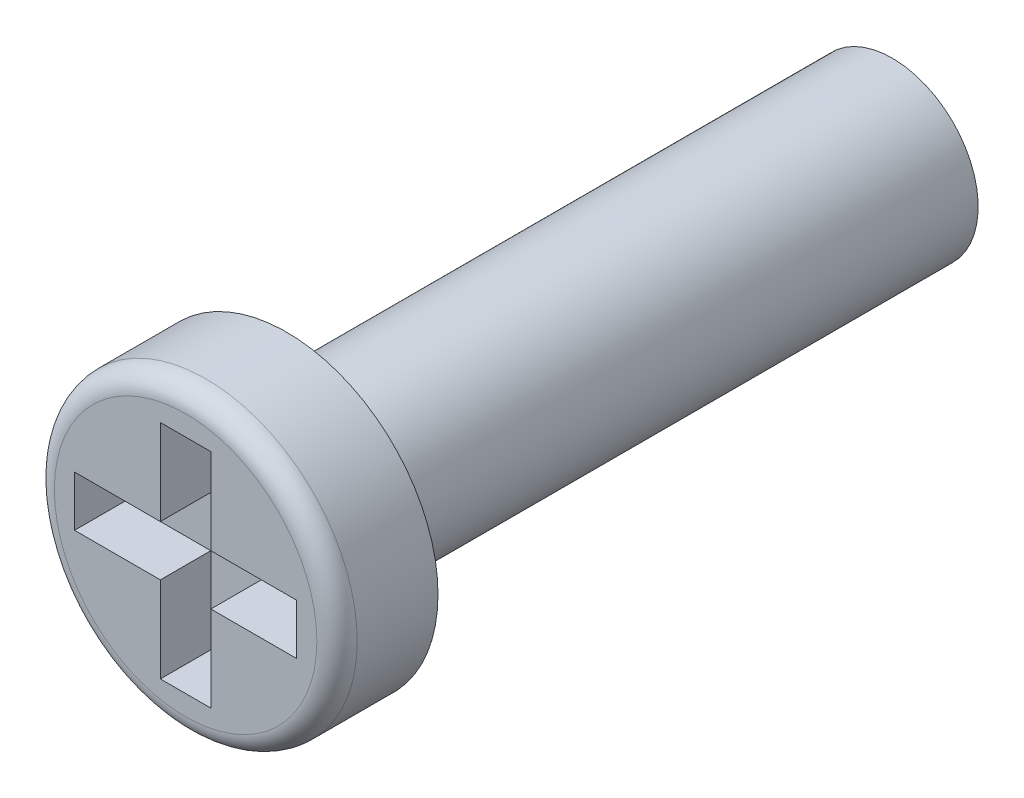
ISO-10303-21;
HEADER;
FILE_DESCRIPTION(('STEP AP214'),'2;1');
FILE_NAME('part.step','',(''),(''),'','','');
FILE_SCHEMA(('AUTOMOTIVE_DESIGN { 1 0 10303 214 1 1 1 1 }'));
ENDSEC;
DATA;
#1=APPLICATION_CONTEXT('core data for automotive mechanical design processes');
#2=APPLICATION_PROTOCOL_DEFINITION('international standard','automotive_design',2000,#1);
#3=PRODUCT_CONTEXT('',#1,'mechanical');
#4=PRODUCT('Part','Part','',(#3));
#5=PRODUCT_RELATED_PRODUCT_CATEGORY('part','',(#4));
#6=PRODUCT_DEFINITION_FORMATION('','',#4);
#7=PRODUCT_DEFINITION_CONTEXT('part definition',#1,'design');
#8=PRODUCT_DEFINITION('design','',#6,#7);
#9=PRODUCT_DEFINITION_SHAPE('','',#8);
#10=(LENGTH_UNIT() NAMED_UNIT(*) SI_UNIT(.MILLI.,.METRE.));
#11=(NAMED_UNIT(*) PLANE_ANGLE_UNIT() SI_UNIT($,.RADIAN.));
#12=(NAMED_UNIT(*) SI_UNIT($,.STERADIAN.) SOLID_ANGLE_UNIT());
#13=UNCERTAINTY_MEASURE_WITH_UNIT(LENGTH_MEASURE(1.E-05),#10,'distance_accuracy_value','');
#14=(GEOMETRIC_REPRESENTATION_CONTEXT(3) GLOBAL_UNCERTAINTY_ASSIGNED_CONTEXT((#13)) GLOBAL_UNIT_ASSIGNED_CONTEXT((#10,
#11,#12)) REPRESENTATION_CONTEXT('',''));
#15=CARTESIAN_POINT('',(0.,0.,0.));
#16=DIRECTION('',(0.,0.,1.));
#17=DIRECTION('',(1.,0.,0.));
#18=AXIS2_PLACEMENT_3D('',#15,#16,#17);
#19=CARTESIAN_POINT('',(0.,0.,1.));
#20=DIRECTION('',(0.,0.,-1.));
#21=DIRECTION('',(-1.,0.,0.));
#22=AXIS2_PLACEMENT_3D('',#19,#20,#21);
#23=CYLINDRICAL_SURFACE('',#22,1.5);
#24=CARTESIAN_POINT('',(0.,0.,0.8));
#25=DIRECTION('',(0.,0.,1.));
#26=DIRECTION('',(1.,0.,0.));
#27=AXIS2_PLACEMENT_3D('',#24,#25,#26);
#28=CIRCLE('',#27,1.5);
#29=CARTESIAN_POINT('',(1.5,0.,0.8));
#30=VERTEX_POINT('',#29);
#31=EDGE_CURVE('E11',#30,#30,#28,.F.);
#32=ORIENTED_EDGE('',*,*,#31,.T.);
#33=EDGE_LOOP('',(#32));
#34=FACE_BOUND('',#33,.T.);
#35=CARTESIAN_POINT('',(0.,0.,0.));
#36=DIRECTION('',(0.,0.,1.));
#37=DIRECTION('',(1.,0.,0.));
#38=AXIS2_PLACEMENT_3D('',#35,#36,#37);
#39=CIRCLE('',#38,1.5);
#40=CARTESIAN_POINT('',(1.5,0.,0.));
#41=VERTEX_POINT('',#40);
#42=EDGE_CURVE('E210',#41,#41,#39,.T.);
#43=ORIENTED_EDGE('',*,*,#42,.T.);
#44=EDGE_LOOP('',(#43));
#45=FACE_BOUND('',#44,.T.);
#46=ADVANCED_FACE('F34',(#34,#45),#23,.T.);
#47=CARTESIAN_POINT('',(0.,0.,1.));
#48=DIRECTION('',(0.,0.,1.));
#49=DIRECTION('',(1.,0.,0.));
#50=AXIS2_PLACEMENT_3D('',#47,#48,#49);
#51=PLANE('',#50);
#52=CARTESIAN_POINT('',(0.,0.,1.));
#53=DIRECTION('',(0.,0.,1.));
#54=DIRECTION('',(1.,0.,0.));
#55=AXIS2_PLACEMENT_3D('',#52,#53,#54);
#56=CIRCLE('',#55,1.3);
#57=CARTESIAN_POINT('',(1.3,0.,1.));
#58=VERTEX_POINT('',#57);
#59=EDGE_CURVE('E42',#58,#58,#56,.T.);
#60=ORIENTED_EDGE('',*,*,#59,.T.);
#61=EDGE_LOOP('',(#60));
#62=FACE_BOUND('',#61,.T.);
#63=DIRECTION('',(0.,1.,0.));
#64=VECTOR('',#63,1.);
#65=CARTESIAN_POINT('',(0.25,-1.1,1.));
#66=LINE('',#65,#64);
#67=CARTESIAN_POINT('',(0.25,-1.1,1.));
#68=VERTEX_POINT('',#67);
#69=CARTESIAN_POINT('',(0.25,-0.25,1.));
#70=VERTEX_POINT('',#69);
#71=EDGE_CURVE('E49',#68,#70,#66,.T.);
#72=ORIENTED_EDGE('',*,*,#71,.F.);
#73=DIRECTION('',(1.,0.,0.));
#74=VECTOR('',#73,1.);
#75=CARTESIAN_POINT('',(-0.25,-1.1,1.));
#76=LINE('',#75,#74);
#77=CARTESIAN_POINT('',(-0.25,-1.1,1.));
#78=VERTEX_POINT('',#77);
#79=EDGE_CURVE('E186',#78,#68,#76,.T.);
#80=ORIENTED_EDGE('',*,*,#79,.F.);
#81=DIRECTION('',(0.,-1.,0.));
#82=VECTOR('',#81,1.);
#83=CARTESIAN_POINT('',(-0.25,-1.1,1.));
#84=LINE('',#83,#82);
#85=CARTESIAN_POINT('',(-0.25,-0.25,1.));
#86=VERTEX_POINT('',#85);
#87=EDGE_CURVE('E184',#86,#78,#84,.T.);
#88=ORIENTED_EDGE('',*,*,#87,.F.);
#89=DIRECTION('',(1.,0.,0.));
#90=VECTOR('',#89,1.);
#91=CARTESIAN_POINT('',(-1.1,-0.25,1.));
#92=LINE('',#91,#90);
#93=CARTESIAN_POINT('',(-1.1,-0.25,1.));
#94=VERTEX_POINT('',#93);
#95=EDGE_CURVE('E133',#94,#86,#92,.T.);
#96=ORIENTED_EDGE('',*,*,#95,.F.);
#97=DIRECTION('',(0.,-1.,0.));
#98=VECTOR('',#97,1.);
#99=CARTESIAN_POINT('',(-1.1,0.25,1.));
#100=LINE('',#99,#98);
#101=CARTESIAN_POINT('',(-1.1,0.25,1.));
#102=VERTEX_POINT('',#101);
#103=EDGE_CURVE('E180',#102,#94,#100,.T.);
#104=ORIENTED_EDGE('',*,*,#103,.F.);
#105=DIRECTION('',(-1.,0.,0.));
#106=VECTOR('',#105,1.);
#107=CARTESIAN_POINT('',(-1.1,0.25,1.));
#108=LINE('',#107,#106);
#109=CARTESIAN_POINT('',(-0.25,0.25,1.));
#110=VERTEX_POINT('',#109);
#111=EDGE_CURVE('E177',#110,#102,#108,.T.);
#112=ORIENTED_EDGE('',*,*,#111,.F.);
#113=DIRECTION('',(0.,-1.,0.));
#114=VECTOR('',#113,1.);
#115=CARTESIAN_POINT('',(-0.25,1.1,1.));
#116=LINE('',#115,#114);
#117=CARTESIAN_POINT('',(-0.25,1.1,1.));
#118=VERTEX_POINT('',#117);
#119=EDGE_CURVE('E174',#118,#110,#116,.T.);
#120=ORIENTED_EDGE('',*,*,#119,.F.);
#121=DIRECTION('',(-1.,0.,0.));
#122=VECTOR('',#121,1.);
#123=CARTESIAN_POINT('',(-0.25,1.1,1.));
#124=LINE('',#123,#122);
#125=CARTESIAN_POINT('',(0.25,1.1,1.));
#126=VERTEX_POINT('',#125);
#127=EDGE_CURVE('E171',#126,#118,#124,.T.);
#128=ORIENTED_EDGE('',*,*,#127,.F.);
#129=DIRECTION('',(0.,1.,0.));
#130=VECTOR('',#129,1.);
#131=CARTESIAN_POINT('',(0.25,1.1,1.));
#132=LINE('',#131,#130);
#133=CARTESIAN_POINT('',(0.25,0.25,1.));
#134=VERTEX_POINT('',#133);
#135=EDGE_CURVE('E168',#134,#126,#132,.T.);
#136=ORIENTED_EDGE('',*,*,#135,.F.);
#137=DIRECTION('',(-1.,0.,0.));
#138=VECTOR('',#137,1.);
#139=CARTESIAN_POINT('',(0.25,0.25,1.));
#140=LINE('',#139,#138);
#141=CARTESIAN_POINT('',(1.1,0.25,1.));
#142=VERTEX_POINT('',#141);
#143=EDGE_CURVE('E165',#142,#134,#140,.T.);
#144=ORIENTED_EDGE('',*,*,#143,.F.);
#145=DIRECTION('',(0.,1.,0.));
#146=VECTOR('',#145,1.);
#147=CARTESIAN_POINT('',(1.1,0.25,1.));
#148=LINE('',#147,#146);
#149=CARTESIAN_POINT('',(1.1,-0.25,1.));
#150=VERTEX_POINT('',#149);
#151=EDGE_CURVE('E162',#150,#142,#148,.T.);
#152=ORIENTED_EDGE('',*,*,#151,.F.);
#153=DIRECTION('',(1.,0.,0.));
#154=VECTOR('',#153,1.);
#155=CARTESIAN_POINT('',(0.25,-0.25,1.));
#156=LINE('',#155,#154);
#157=EDGE_CURVE('E159',#70,#150,#156,.T.);
#158=ORIENTED_EDGE('',*,*,#157,.F.);
#159=EDGE_LOOP('',(#72,#80,#88,#96,#104,#112,#120,#128,#136,#144,#152,#158));
#160=FACE_BOUND('',#159,.T.);
#161=ADVANCED_FACE('F218',(#62,#160),#51,.T.);
#162=CARTESIAN_POINT('',(0.,0.,0.));
#163=DIRECTION('',(0.,0.,1.));
#164=DIRECTION('',(1.,0.,0.));
#165=AXIS2_PLACEMENT_3D('',#162,#163,#164);
#166=PLANE('',#165);
#167=CARTESIAN_POINT('',(0.,0.,0.));
#168=DIRECTION('',(0.,0.,-1.));
#169=DIRECTION('',(-1.,0.,0.));
#170=AXIS2_PLACEMENT_3D('',#167,#168,#169);
#171=CIRCLE('',#170,0.85);
#172=CARTESIAN_POINT('',(-0.85,0.,0.));
#173=VERTEX_POINT('',#172);
#174=EDGE_CURVE('E211',#173,#173,#171,.T.);
#175=ORIENTED_EDGE('',*,*,#174,.F.);
#176=EDGE_LOOP('',(#175));
#177=FACE_BOUND('',#176,.T.);
#178=ORIENTED_EDGE('',*,*,#42,.F.);
#179=EDGE_LOOP('',(#178));
#180=FACE_BOUND('',#179,.T.);
#181=ADVANCED_FACE('F234',(#177,#180),#166,.F.);
#182=CARTESIAN_POINT('',(0.,0.,-6.));
#183=DIRECTION('',(0.,0.,1.));
#184=DIRECTION('',(1.,0.,0.));
#185=AXIS2_PLACEMENT_3D('',#182,#183,#184);
#186=CYLINDRICAL_SURFACE('',#185,0.85);
#187=CARTESIAN_POINT('',(0.,0.,-6.));
#188=DIRECTION('',(0.,0.,-1.));
#189=DIRECTION('',(-1.,0.,0.));
#190=AXIS2_PLACEMENT_3D('',#187,#188,#189);
#191=CIRCLE('',#190,0.85);
#192=CARTESIAN_POINT('',(-0.85,0.,-6.));
#193=VERTEX_POINT('',#192);
#194=EDGE_CURVE('E190',#193,#193,#191,.T.);
#195=ORIENTED_EDGE('',*,*,#194,.F.);
#196=EDGE_LOOP('',(#195));
#197=FACE_BOUND('',#196,.T.);
#198=ORIENTED_EDGE('',*,*,#174,.T.);
#199=EDGE_LOOP('',(#198));
#200=FACE_BOUND('',#199,.T.);
#201=ADVANCED_FACE('F239',(#197,#200),#186,.T.);
#202=CARTESIAN_POINT('',(0.,0.,-6.));
#203=DIRECTION('',(0.,0.,-1.));
#204=DIRECTION('',(-1.,0.,0.));
#205=AXIS2_PLACEMENT_3D('',#202,#203,#204);
#206=PLANE('',#205);
#207=ORIENTED_EDGE('',*,*,#194,.T.);
#208=EDGE_LOOP('',(#207));
#209=FACE_BOUND('',#208,.T.);
#210=ADVANCED_FACE('F244',(#209),#206,.T.);
#211=CARTESIAN_POINT('',(0.25,-1.1,0.5));
#212=DIRECTION('',(1.,0.,0.));
#213=DIRECTION('',(0.,1.,0.));
#214=AXIS2_PLACEMENT_3D('',#211,#212,#213);
#215=PLANE('',#214);
#216=ORIENTED_EDGE('',*,*,#71,.T.);
#217=DIRECTION('',(0.,0.,1.));
#218=VECTOR('',#217,1.);
#219=CARTESIAN_POINT('',(0.25,-0.25,0.5));
#220=LINE('',#219,#218);
#221=CARTESIAN_POINT('',(0.25,-0.25,0.5));
#222=VERTEX_POINT('',#221);
#223=EDGE_CURVE('E97',#222,#70,#220,.T.);
#224=ORIENTED_EDGE('',*,*,#223,.F.);
#225=DIRECTION('',(0.,1.,0.));
#226=VECTOR('',#225,1.);
#227=CARTESIAN_POINT('',(0.25,-1.1,0.5));
#228=LINE('',#227,#226);
#229=CARTESIAN_POINT('',(0.25,-1.1,0.5));
#230=VERTEX_POINT('',#229);
#231=EDGE_CURVE('E188',#230,#222,#228,.T.);
#232=ORIENTED_EDGE('',*,*,#231,.F.);
#233=DIRECTION('',(0.,0.,1.));
#234=VECTOR('',#233,1.);
#235=CARTESIAN_POINT('',(0.25,-1.1,0.5));
#236=LINE('',#235,#234);
#237=EDGE_CURVE('E57',#230,#68,#236,.T.);
#238=ORIENTED_EDGE('',*,*,#237,.T.);
#239=EDGE_LOOP('',(#216,#224,#232,#238));
#240=FACE_BOUND('',#239,.T.);
#241=ADVANCED_FACE('F248',(#240),#215,.F.);
#242=CARTESIAN_POINT('',(-0.25,-1.1,0.5));
#243=DIRECTION('',(0.,-1.,0.));
#244=DIRECTION('',(0.,0.,-1.));
#245=AXIS2_PLACEMENT_3D('',#242,#243,#244);
#246=PLANE('',#245);
#247=ORIENTED_EDGE('',*,*,#79,.T.);
#248=ORIENTED_EDGE('',*,*,#237,.F.);
#249=DIRECTION('',(1.,0.,0.));
#250=VECTOR('',#249,1.);
#251=CARTESIAN_POINT('',(-0.25,-1.1,0.5));
#252=LINE('',#251,#250);
#253=CARTESIAN_POINT('',(-0.25,-1.1,0.5));
#254=VERTEX_POINT('',#253);
#255=EDGE_CURVE('E145',#254,#230,#252,.T.);
#256=ORIENTED_EDGE('',*,*,#255,.F.);
#257=DIRECTION('',(0.,0.,1.));
#258=VECTOR('',#257,1.);
#259=CARTESIAN_POINT('',(-0.25,-1.1,0.5));
#260=LINE('',#259,#258);
#261=EDGE_CURVE('E137',#254,#78,#260,.T.);
#262=ORIENTED_EDGE('',*,*,#261,.T.);
#263=EDGE_LOOP('',(#247,#248,#256,#262));
#264=FACE_BOUND('',#263,.T.);
#265=ADVANCED_FACE('F252',(#264),#246,.F.);
#266=CARTESIAN_POINT('',(-0.25,-1.1,0.5));
#267=DIRECTION('',(-1.,0.,0.));
#268=DIRECTION('',(0.,-1.,0.));
#269=AXIS2_PLACEMENT_3D('',#266,#267,#268);
#270=PLANE('',#269);
#271=ORIENTED_EDGE('',*,*,#87,.T.);
#272=ORIENTED_EDGE('',*,*,#261,.F.);
#273=DIRECTION('',(0.,-1.,0.));
#274=VECTOR('',#273,1.);
#275=CARTESIAN_POINT('',(-0.25,-1.1,0.5));
#276=LINE('',#275,#274);
#277=CARTESIAN_POINT('',(-0.25,-0.25,0.5));
#278=VERTEX_POINT('',#277);
#279=EDGE_CURVE('E141',#278,#254,#276,.T.);
#280=ORIENTED_EDGE('',*,*,#279,.F.);
#281=DIRECTION('',(0.,0.,1.));
#282=VECTOR('',#281,1.);
#283=CARTESIAN_POINT('',(-0.25,-0.25,0.5));
#284=LINE('',#283,#282);
#285=EDGE_CURVE('E126',#278,#86,#284,.T.);
#286=ORIENTED_EDGE('',*,*,#285,.T.);
#287=EDGE_LOOP('',(#271,#272,#280,#286));
#288=FACE_BOUND('',#287,.T.);
#289=ADVANCED_FACE('F142',(#288),#270,.F.);
#290=CARTESIAN_POINT('',(-1.1,-0.25,0.5));
#291=DIRECTION('',(0.,-1.,0.));
#292=DIRECTION('',(0.,0.,-1.));
#293=AXIS2_PLACEMENT_3D('',#290,#291,#292);
#294=PLANE('',#293);
#295=ORIENTED_EDGE('',*,*,#95,.T.);
#296=ORIENTED_EDGE('',*,*,#285,.F.);
#297=DIRECTION('',(1.,0.,0.));
#298=VECTOR('',#297,1.);
#299=CARTESIAN_POINT('',(-1.1,-0.25,0.5));
#300=LINE('',#299,#298);
#301=CARTESIAN_POINT('',(-1.1,-0.25,0.5));
#302=VERTEX_POINT('',#301);
#303=EDGE_CURVE('E130',#302,#278,#300,.T.);
#304=ORIENTED_EDGE('',*,*,#303,.F.);
#305=DIRECTION('',(0.,0.,1.));
#306=VECTOR('',#305,1.);
#307=CARTESIAN_POINT('',(-1.1,-0.25,0.5));
#308=LINE('',#307,#306);
#309=EDGE_CURVE('E138',#302,#94,#308,.T.);
#310=ORIENTED_EDGE('',*,*,#309,.T.);
#311=EDGE_LOOP('',(#295,#296,#304,#310));
#312=FACE_BOUND('',#311,.T.);
#313=ADVANCED_FACE('F128',(#312),#294,.F.);
#314=CARTESIAN_POINT('',(-1.1,0.25,0.5));
#315=DIRECTION('',(-1.,0.,0.));
#316=DIRECTION('',(0.,0.,1.));
#317=AXIS2_PLACEMENT_3D('',#314,#315,#316);
#318=PLANE('',#317);
#319=ORIENTED_EDGE('',*,*,#103,.T.);
#320=ORIENTED_EDGE('',*,*,#309,.F.);
#321=DIRECTION('',(0.,-1.,0.));
#322=VECTOR('',#321,1.);
#323=CARTESIAN_POINT('',(-1.1,0.25,0.5));
#324=LINE('',#323,#322);
#325=CARTESIAN_POINT('',(-1.1,0.25,0.5));
#326=VERTEX_POINT('',#325);
#327=EDGE_CURVE('E151',#326,#302,#324,.T.);
#328=ORIENTED_EDGE('',*,*,#327,.F.);
#329=DIRECTION('',(0.,0.,1.));
#330=VECTOR('',#329,1.);
#331=CARTESIAN_POINT('',(-1.1,0.25,0.5));
#332=LINE('',#331,#330);
#333=EDGE_CURVE('E193',#326,#102,#332,.T.);
#334=ORIENTED_EDGE('',*,*,#333,.T.);
#335=EDGE_LOOP('',(#319,#320,#328,#334));
#336=FACE_BOUND('',#335,.T.);
#337=ADVANCED_FACE('F279',(#336),#318,.F.);
#338=CARTESIAN_POINT('',(-1.1,0.25,0.5));
#339=DIRECTION('',(0.,1.,0.));
#340=DIRECTION('',(0.,0.,1.));
#341=AXIS2_PLACEMENT_3D('',#338,#339,#340);
#342=PLANE('',#341);
#343=ORIENTED_EDGE('',*,*,#111,.T.);
#344=ORIENTED_EDGE('',*,*,#333,.F.);
#345=DIRECTION('',(-1.,0.,0.));
#346=VECTOR('',#345,1.);
#347=CARTESIAN_POINT('',(-1.1,0.25,0.5));
#348=LINE('',#347,#346);
#349=CARTESIAN_POINT('',(-0.25,0.25,0.5));
#350=VERTEX_POINT('',#349);
#351=EDGE_CURVE('E153',#350,#326,#348,.T.);
#352=ORIENTED_EDGE('',*,*,#351,.F.);
#353=DIRECTION('',(0.,0.,1.));
#354=VECTOR('',#353,1.);
#355=CARTESIAN_POINT('',(-0.25,0.25,0.5));
#356=LINE('',#355,#354);
#357=EDGE_CURVE('E195',#350,#110,#356,.T.);
#358=ORIENTED_EDGE('',*,*,#357,.T.);
#359=EDGE_LOOP('',(#343,#344,#352,#358));
#360=FACE_BOUND('',#359,.T.);
#361=ADVANCED_FACE('F275',(#360),#342,.F.);
#362=CARTESIAN_POINT('',(-0.25,1.1,0.5));
#363=DIRECTION('',(-1.,0.,0.));
#364=DIRECTION('',(0.,-1.,0.));
#365=AXIS2_PLACEMENT_3D('',#362,#363,#364);
#366=PLANE('',#365);
#367=ORIENTED_EDGE('',*,*,#119,.T.);
#368=ORIENTED_EDGE('',*,*,#357,.F.);
#369=DIRECTION('',(0.,-1.,0.));
#370=VECTOR('',#369,1.);
#371=CARTESIAN_POINT('',(-0.25,1.1,0.5));
#372=LINE('',#371,#370);
#373=CARTESIAN_POINT('',(-0.25,1.1,0.5));
#374=VERTEX_POINT('',#373);
#375=EDGE_CURVE('E313',#374,#350,#372,.T.);
#376=ORIENTED_EDGE('',*,*,#375,.F.);
#377=DIRECTION('',(0.,0.,1.));
#378=VECTOR('',#377,1.);
#379=CARTESIAN_POINT('',(-0.25,1.1,0.5));
#380=LINE('',#379,#378);
#381=EDGE_CURVE('E197',#374,#118,#380,.T.);
#382=ORIENTED_EDGE('',*,*,#381,.T.);
#383=EDGE_LOOP('',(#367,#368,#376,#382));
#384=FACE_BOUND('',#383,.T.);
#385=ADVANCED_FACE('F271',(#384),#366,.F.);
#386=CARTESIAN_POINT('',(-0.25,1.1,0.5));
#387=DIRECTION('',(0.,1.,0.));
#388=DIRECTION('',(0.,0.,1.));
#389=AXIS2_PLACEMENT_3D('',#386,#387,#388);
#390=PLANE('',#389);
#391=ORIENTED_EDGE('',*,*,#127,.T.);
#392=ORIENTED_EDGE('',*,*,#381,.F.);
#393=DIRECTION('',(-1.,0.,0.));
#394=VECTOR('',#393,1.);
#395=CARTESIAN_POINT('',(-0.25,1.1,0.5));
#396=LINE('',#395,#394);
#397=CARTESIAN_POINT('',(0.25,1.1,0.5));
#398=VERTEX_POINT('',#397);
#399=EDGE_CURVE('E310',#398,#374,#396,.T.);
#400=ORIENTED_EDGE('',*,*,#399,.F.);
#401=DIRECTION('',(0.,0.,1.));
#402=VECTOR('',#401,1.);
#403=CARTESIAN_POINT('',(0.25,1.1,0.5));
#404=LINE('',#403,#402);
#405=EDGE_CURVE('E199',#398,#126,#404,.T.);
#406=ORIENTED_EDGE('',*,*,#405,.T.);
#407=EDGE_LOOP('',(#391,#392,#400,#406));
#408=FACE_BOUND('',#407,.T.);
#409=ADVANCED_FACE('F267',(#408),#390,.F.);
#410=CARTESIAN_POINT('',(0.25,1.1,0.5));
#411=DIRECTION('',(1.,0.,0.));
#412=DIRECTION('',(0.,1.,0.));
#413=AXIS2_PLACEMENT_3D('',#410,#411,#412);
#414=PLANE('',#413);
#415=ORIENTED_EDGE('',*,*,#135,.T.);
#416=ORIENTED_EDGE('',*,*,#405,.F.);
#417=DIRECTION('',(0.,1.,0.));
#418=VECTOR('',#417,1.);
#419=CARTESIAN_POINT('',(0.25,1.1,0.5));
#420=LINE('',#419,#418);
#421=CARTESIAN_POINT('',(0.25,0.25,0.5));
#422=VERTEX_POINT('',#421);
#423=EDGE_CURVE('E307',#422,#398,#420,.T.);
#424=ORIENTED_EDGE('',*,*,#423,.F.);
#425=DIRECTION('',(0.,0.,1.));
#426=VECTOR('',#425,1.);
#427=CARTESIAN_POINT('',(0.25,0.25,0.5));
#428=LINE('',#427,#426);
#429=EDGE_CURVE('E201',#422,#134,#428,.T.);
#430=ORIENTED_EDGE('',*,*,#429,.T.);
#431=EDGE_LOOP('',(#415,#416,#424,#430));
#432=FACE_BOUND('',#431,.T.);
#433=ADVANCED_FACE('F263',(#432),#414,.F.);
#434=CARTESIAN_POINT('',(0.25,0.25,0.5));
#435=DIRECTION('',(0.,1.,0.));
#436=DIRECTION('',(0.,0.,1.));
#437=AXIS2_PLACEMENT_3D('',#434,#435,#436);
#438=PLANE('',#437);
#439=ORIENTED_EDGE('',*,*,#143,.T.);
#440=ORIENTED_EDGE('',*,*,#429,.F.);
#441=DIRECTION('',(-1.,0.,0.));
#442=VECTOR('',#441,1.);
#443=CARTESIAN_POINT('',(0.25,0.25,0.5));
#444=LINE('',#443,#442);
#445=CARTESIAN_POINT('',(1.1,0.25,0.5));
#446=VERTEX_POINT('',#445);
#447=EDGE_CURVE('E304',#446,#422,#444,.T.);
#448=ORIENTED_EDGE('',*,*,#447,.F.);
#449=DIRECTION('',(0.,0.,1.));
#450=VECTOR('',#449,1.);
#451=CARTESIAN_POINT('',(1.1,0.25,0.5));
#452=LINE('',#451,#450);
#453=EDGE_CURVE('E203',#446,#142,#452,.T.);
#454=ORIENTED_EDGE('',*,*,#453,.T.);
#455=EDGE_LOOP('',(#439,#440,#448,#454));
#456=FACE_BOUND('',#455,.T.);
#457=ADVANCED_FACE('F259',(#456),#438,.F.);
#458=CARTESIAN_POINT('',(1.1,0.25,0.5));
#459=DIRECTION('',(1.,0.,0.));
#460=DIRECTION('',(0.,0.,-1.));
#461=AXIS2_PLACEMENT_3D('',#458,#459,#460);
#462=PLANE('',#461);
#463=ORIENTED_EDGE('',*,*,#151,.T.);
#464=ORIENTED_EDGE('',*,*,#453,.F.);
#465=DIRECTION('',(0.,1.,0.));
#466=VECTOR('',#465,1.);
#467=CARTESIAN_POINT('',(1.1,0.25,0.5));
#468=LINE('',#467,#466);
#469=CARTESIAN_POINT('',(1.1,-0.25,0.5));
#470=VERTEX_POINT('',#469);
#471=EDGE_CURVE('E299',#470,#446,#468,.T.);
#472=ORIENTED_EDGE('',*,*,#471,.F.);
#473=DIRECTION('',(0.,0.,1.));
#474=VECTOR('',#473,1.);
#475=CARTESIAN_POINT('',(1.1,-0.25,0.5));
#476=LINE('',#475,#474);
#477=EDGE_CURVE('E205',#470,#150,#476,.T.);
#478=ORIENTED_EDGE('',*,*,#477,.T.);
#479=EDGE_LOOP('',(#463,#464,#472,#478));
#480=FACE_BOUND('',#479,.T.);
#481=ADVANCED_FACE('F255',(#480),#462,.F.);
#482=CARTESIAN_POINT('',(0.25,-0.25,0.5));
#483=DIRECTION('',(0.,-1.,0.));
#484=DIRECTION('',(0.,0.,-1.));
#485=AXIS2_PLACEMENT_3D('',#482,#483,#484);
#486=PLANE('',#485);
#487=ORIENTED_EDGE('',*,*,#157,.T.);
#488=ORIENTED_EDGE('',*,*,#477,.F.);
#489=DIRECTION('',(1.,0.,0.));
#490=VECTOR('',#489,1.);
#491=CARTESIAN_POINT('',(0.25,-0.25,0.5));
#492=LINE('',#491,#490);
#493=EDGE_CURVE('E297',#222,#470,#492,.T.);
#494=ORIENTED_EDGE('',*,*,#493,.F.);
#495=ORIENTED_EDGE('',*,*,#223,.T.);
#496=EDGE_LOOP('',(#487,#488,#494,#495));
#497=FACE_BOUND('',#496,.T.);
#498=ADVANCED_FACE('F226',(#497),#486,.F.);
#499=CARTESIAN_POINT('',(0.,0.,0.5));
#500=DIRECTION('',(0.,0.,-1.));
#501=DIRECTION('',(-1.,0.,0.));
#502=AXIS2_PLACEMENT_3D('',#499,#500,#501);
#503=PLANE('',#502);
#504=ORIENTED_EDGE('',*,*,#231,.T.);
#505=ORIENTED_EDGE('',*,*,#493,.T.);
#506=ORIENTED_EDGE('',*,*,#471,.T.);
#507=ORIENTED_EDGE('',*,*,#447,.T.);
#508=ORIENTED_EDGE('',*,*,#423,.T.);
#509=ORIENTED_EDGE('',*,*,#399,.T.);
#510=ORIENTED_EDGE('',*,*,#375,.T.);
#511=ORIENTED_EDGE('',*,*,#351,.T.);
#512=ORIENTED_EDGE('',*,*,#327,.T.);
#513=ORIENTED_EDGE('',*,*,#303,.T.);
#514=ORIENTED_EDGE('',*,*,#279,.T.);
#515=ORIENTED_EDGE('',*,*,#255,.T.);
#516=EDGE_LOOP('',(#504,#505,#506,#507,#508,#509,#510,#511,#512,#513,#514,#515));
#517=FACE_BOUND('',#516,.T.);
#518=ADVANCED_FACE('F148',(#517),#503,.F.);
#519=CARTESIAN_POINT('',(0.,0.,0.8));
#520=DIRECTION('',(0.,0.,1.));
#521=DIRECTION('',(1.,0.,0.));
#522=AXIS2_PLACEMENT_3D('',#519,#520,#521);
#523=TOROIDAL_SURFACE('',#522,1.3,0.2);
#524=ORIENTED_EDGE('',*,*,#31,.F.);
#525=EDGE_LOOP('',(#524));
#526=FACE_BOUND('',#525,.T.);
#527=ORIENTED_EDGE('',*,*,#59,.F.);
#528=EDGE_LOOP('',(#527));
#529=FACE_BOUND('',#528,.T.);
#530=ADVANCED_FACE('F36',(#526,#529),#523,.T.);
#531=CLOSED_SHELL('',(#46,#161,#181,#201,#210,#241,#265,#289,#313,#337,#361,#385,#409,#433,#457,
#481,#498,#518,#530));
#532=MANIFOLD_SOLID_BREP('B2',#531);
#533=ADVANCED_BREP_SHAPE_REPRESENTATION('',(#18,#532),#14);
#534=SHAPE_DEFINITION_REPRESENTATION(#9,#533);
ENDSEC;
END-ISO-10303-21;
